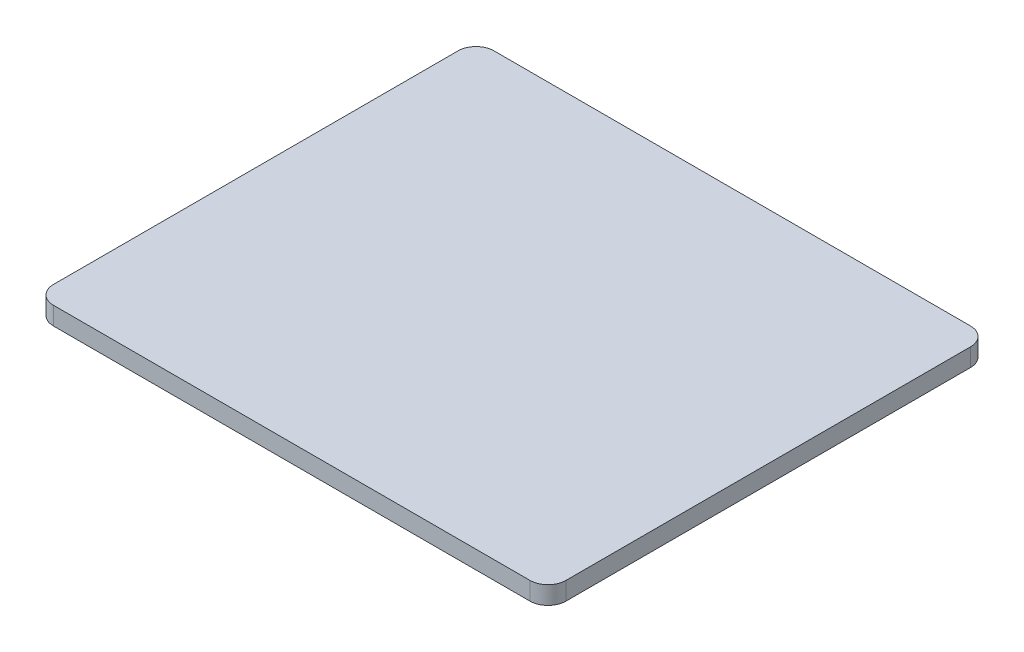
ISO-10303-21;
HEADER;
FILE_DESCRIPTION(('STEP AP214'),'2;1');
FILE_NAME('part.step','',(''),(''),'','','');
FILE_SCHEMA(('AUTOMOTIVE_DESIGN { 1 0 10303 214 1 1 1 1 }'));
ENDSEC;
DATA;
#1=APPLICATION_CONTEXT('core data for automotive mechanical design processes');
#2=APPLICATION_PROTOCOL_DEFINITION('international standard','automotive_design',2000,#1);
#3=PRODUCT_CONTEXT('',#1,'mechanical');
#4=PRODUCT('Part','Part','',(#3));
#5=PRODUCT_RELATED_PRODUCT_CATEGORY('part','',(#4));
#6=PRODUCT_DEFINITION_FORMATION('','',#4);
#7=PRODUCT_DEFINITION_CONTEXT('part definition',#1,'design');
#8=PRODUCT_DEFINITION('design','',#6,#7);
#9=PRODUCT_DEFINITION_SHAPE('','',#8);
#10=(LENGTH_UNIT() NAMED_UNIT(*) SI_UNIT(.MILLI.,.METRE.));
#11=(NAMED_UNIT(*) PLANE_ANGLE_UNIT() SI_UNIT($,.RADIAN.));
#12=(NAMED_UNIT(*) SI_UNIT($,.STERADIAN.) SOLID_ANGLE_UNIT());
#13=UNCERTAINTY_MEASURE_WITH_UNIT(LENGTH_MEASURE(1.E-05),#10,'distance_accuracy_value','');
#14=(GEOMETRIC_REPRESENTATION_CONTEXT(3) GLOBAL_UNCERTAINTY_ASSIGNED_CONTEXT((#13)) GLOBAL_UNIT_ASSIGNED_CONTEXT((#10,
#11,#12)) REPRESENTATION_CONTEXT('',''));
#15=CARTESIAN_POINT('',(0.,0.,0.));
#16=DIRECTION('',(0.,0.,1.));
#17=DIRECTION('',(1.,0.,0.));
#18=AXIS2_PLACEMENT_3D('',#15,#16,#17);
#19=CARTESIAN_POINT('',(-26.5,2.,22.5));
#20=DIRECTION('',(0.,-1.,0.));
#21=DIRECTION('',(0.,0.,-1.));
#22=AXIS2_PLACEMENT_3D('',#19,#20,#21);
#23=CYLINDRICAL_SURFACE('',#22,2.);
#24=CARTESIAN_POINT('',(-26.5,0.,22.5));
#25=DIRECTION('',(0.,1.,0.));
#26=DIRECTION('',(0.,0.,1.));
#27=AXIS2_PLACEMENT_3D('',#24,#25,#26);
#28=CIRCLE('',#27,2.);
#29=CARTESIAN_POINT('',(-28.5,0.,22.5));
#30=VERTEX_POINT('',#29);
#31=CARTESIAN_POINT('',(-26.5,0.,24.5));
#32=VERTEX_POINT('',#31);
#33=EDGE_CURVE('E129',#30,#32,#28,.T.);
#34=ORIENTED_EDGE('',*,*,#33,.T.);
#35=DIRECTION('',(0.,-1.,0.));
#36=VECTOR('',#35,1.);
#37=CARTESIAN_POINT('',(-26.5,2.,24.5));
#38=LINE('',#37,#36);
#39=CARTESIAN_POINT('',(-26.5,2.,24.5));
#40=VERTEX_POINT('',#39);
#41=EDGE_CURVE('E11',#40,#32,#38,.T.);
#42=ORIENTED_EDGE('',*,*,#41,.F.);
#43=CARTESIAN_POINT('',(-26.5,2.,22.5));
#44=DIRECTION('',(0.,1.,0.));
#45=DIRECTION('',(0.,0.,1.));
#46=AXIS2_PLACEMENT_3D('',#43,#44,#45);
#47=CIRCLE('',#46,2.);
#48=CARTESIAN_POINT('',(-28.5,2.,22.5));
#49=VERTEX_POINT('',#48);
#50=EDGE_CURVE('E143',#49,#40,#47,.T.);
#51=ORIENTED_EDGE('',*,*,#50,.F.);
#52=DIRECTION('',(0.,-1.,0.));
#53=VECTOR('',#52,1.);
#54=CARTESIAN_POINT('',(-28.5,2.,22.5));
#55=LINE('',#54,#53);
#56=EDGE_CURVE('E125',#49,#30,#55,.T.);
#57=ORIENTED_EDGE('',*,*,#56,.T.);
#58=EDGE_LOOP('',(#34,#42,#51,#57));
#59=FACE_BOUND('',#58,.T.);
#60=ADVANCED_FACE('F33',(#59),#23,.T.);
#61=CARTESIAN_POINT('',(-26.5,2.,24.5));
#62=DIRECTION('',(0.,0.,-1.));
#63=DIRECTION('',(-1.,0.,0.));
#64=AXIS2_PLACEMENT_3D('',#61,#62,#63);
#65=PLANE('',#64);
#66=DIRECTION('',(1.,0.,0.));
#67=VECTOR('',#66,1.);
#68=CARTESIAN_POINT('',(-26.5,0.,24.5));
#69=LINE('',#68,#67);
#70=CARTESIAN_POINT('',(26.5,0.,24.5));
#71=VERTEX_POINT('',#70);
#72=EDGE_CURVE('E132',#32,#71,#69,.T.);
#73=ORIENTED_EDGE('',*,*,#72,.T.);
#74=DIRECTION('',(0.,-1.,0.));
#75=VECTOR('',#74,1.);
#76=CARTESIAN_POINT('',(26.5,2.,24.5));
#77=LINE('',#76,#75);
#78=CARTESIAN_POINT('',(26.5,2.,24.5));
#79=VERTEX_POINT('',#78);
#80=EDGE_CURVE('E41',#79,#71,#77,.T.);
#81=ORIENTED_EDGE('',*,*,#80,.F.);
#82=DIRECTION('',(1.,0.,0.));
#83=VECTOR('',#82,1.);
#84=CARTESIAN_POINT('',(-26.5,2.,24.5));
#85=LINE('',#84,#83);
#86=EDGE_CURVE('E92',#40,#79,#85,.T.);
#87=ORIENTED_EDGE('',*,*,#86,.F.);
#88=ORIENTED_EDGE('',*,*,#41,.T.);
#89=EDGE_LOOP('',(#73,#81,#87,#88));
#90=FACE_BOUND('',#89,.T.);
#91=ADVANCED_FACE('F178',(#90),#65,.F.);
#92=CARTESIAN_POINT('',(26.5,2.,22.5));
#93=DIRECTION('',(0.,-1.,0.));
#94=DIRECTION('',(0.,0.,-1.));
#95=AXIS2_PLACEMENT_3D('',#92,#93,#94);
#96=CYLINDRICAL_SURFACE('',#95,2.);
#97=CARTESIAN_POINT('',(26.5,0.,22.5));
#98=DIRECTION('',(0.,1.,0.));
#99=DIRECTION('',(0.,0.,1.));
#100=AXIS2_PLACEMENT_3D('',#97,#98,#99);
#101=CIRCLE('',#100,2.);
#102=CARTESIAN_POINT('',(28.5,0.,22.5));
#103=VERTEX_POINT('',#102);
#104=EDGE_CURVE('E134',#71,#103,#101,.T.);
#105=ORIENTED_EDGE('',*,*,#104,.T.);
#106=DIRECTION('',(0.,-1.,0.));
#107=VECTOR('',#106,1.);
#108=CARTESIAN_POINT('',(28.5,2.,22.5));
#109=LINE('',#108,#107);
#110=CARTESIAN_POINT('',(28.5,2.,22.5));
#111=VERTEX_POINT('',#110);
#112=EDGE_CURVE('E150',#111,#103,#109,.T.);
#113=ORIENTED_EDGE('',*,*,#112,.F.);
#114=CARTESIAN_POINT('',(26.5,2.,22.5));
#115=DIRECTION('',(0.,1.,0.));
#116=DIRECTION('',(0.,0.,1.));
#117=AXIS2_PLACEMENT_3D('',#114,#115,#116);
#118=CIRCLE('',#117,2.);
#119=EDGE_CURVE('E158',#79,#111,#118,.T.);
#120=ORIENTED_EDGE('',*,*,#119,.F.);
#121=ORIENTED_EDGE('',*,*,#80,.T.);
#122=EDGE_LOOP('',(#105,#113,#120,#121));
#123=FACE_BOUND('',#122,.T.);
#124=ADVANCED_FACE('F156',(#123),#96,.T.);
#125=CARTESIAN_POINT('',(28.5,2.,22.5));
#126=DIRECTION('',(-1.,0.,0.));
#127=DIRECTION('',(0.,0.,1.));
#128=AXIS2_PLACEMENT_3D('',#125,#126,#127);
#129=PLANE('',#128);
#130=DIRECTION('',(0.,0.,-1.));
#131=VECTOR('',#130,1.);
#132=CARTESIAN_POINT('',(28.5,0.,22.5));
#133=LINE('',#132,#131);
#134=CARTESIAN_POINT('',(28.5,0.,-22.5));
#135=VERTEX_POINT('',#134);
#136=EDGE_CURVE('E136',#103,#135,#133,.T.);
#137=ORIENTED_EDGE('',*,*,#136,.T.);
#138=DIRECTION('',(0.,-1.,0.));
#139=VECTOR('',#138,1.);
#140=CARTESIAN_POINT('',(28.5,2.,-22.5));
#141=LINE('',#140,#139);
#142=CARTESIAN_POINT('',(28.5,2.,-22.5));
#143=VERTEX_POINT('',#142);
#144=EDGE_CURVE('E147',#143,#135,#141,.T.);
#145=ORIENTED_EDGE('',*,*,#144,.F.);
#146=DIRECTION('',(0.,0.,-1.));
#147=VECTOR('',#146,1.);
#148=CARTESIAN_POINT('',(28.5,2.,22.5));
#149=LINE('',#148,#147);
#150=EDGE_CURVE('E170',#111,#143,#149,.T.);
#151=ORIENTED_EDGE('',*,*,#150,.F.);
#152=ORIENTED_EDGE('',*,*,#112,.T.);
#153=EDGE_LOOP('',(#137,#145,#151,#152));
#154=FACE_BOUND('',#153,.T.);
#155=ADVANCED_FACE('F166',(#154),#129,.F.);
#156=CARTESIAN_POINT('',(26.5,2.,-22.5));
#157=DIRECTION('',(0.,-1.,0.));
#158=DIRECTION('',(0.,0.,-1.));
#159=AXIS2_PLACEMENT_3D('',#156,#157,#158);
#160=CYLINDRICAL_SURFACE('',#159,2.);
#161=CARTESIAN_POINT('',(26.5,0.,-22.5));
#162=DIRECTION('',(0.,1.,0.));
#163=DIRECTION('',(0.,0.,1.));
#164=AXIS2_PLACEMENT_3D('',#161,#162,#163);
#165=CIRCLE('',#164,2.);
#166=CARTESIAN_POINT('',(26.5,0.,-24.5));
#167=VERTEX_POINT('',#166);
#168=EDGE_CURVE('E138',#135,#167,#165,.T.);
#169=ORIENTED_EDGE('',*,*,#168,.T.);
#170=DIRECTION('',(0.,-1.,0.));
#171=VECTOR('',#170,1.);
#172=CARTESIAN_POINT('',(26.5,2.,-24.5));
#173=LINE('',#172,#171);
#174=CARTESIAN_POINT('',(26.5,2.,-24.5));
#175=VERTEX_POINT('',#174);
#176=EDGE_CURVE('E120',#175,#167,#173,.T.);
#177=ORIENTED_EDGE('',*,*,#176,.F.);
#178=CARTESIAN_POINT('',(26.5,2.,-22.5));
#179=DIRECTION('',(0.,1.,0.));
#180=DIRECTION('',(0.,0.,1.));
#181=AXIS2_PLACEMENT_3D('',#178,#179,#180);
#182=CIRCLE('',#181,2.);
#183=EDGE_CURVE('E111',#143,#175,#182,.T.);
#184=ORIENTED_EDGE('',*,*,#183,.F.);
#185=ORIENTED_EDGE('',*,*,#144,.T.);
#186=EDGE_LOOP('',(#169,#177,#184,#185));
#187=FACE_BOUND('',#186,.T.);
#188=ADVANCED_FACE('F169',(#187),#160,.T.);
#189=CARTESIAN_POINT('',(-26.5,2.,-24.5));
#190=DIRECTION('',(0.,0.,1.));
#191=DIRECTION('',(1.,0.,0.));
#192=AXIS2_PLACEMENT_3D('',#189,#190,#191);
#193=PLANE('',#192);
#194=DIRECTION('',(-1.,0.,0.));
#195=VECTOR('',#194,1.);
#196=CARTESIAN_POINT('',(-26.5,0.,-24.5));
#197=LINE('',#196,#195);
#198=CARTESIAN_POINT('',(-26.5,0.,-24.5));
#199=VERTEX_POINT('',#198);
#200=EDGE_CURVE('E119',#167,#199,#197,.T.);
#201=ORIENTED_EDGE('',*,*,#200,.T.);
#202=DIRECTION('',(0.,-1.,0.));
#203=VECTOR('',#202,1.);
#204=CARTESIAN_POINT('',(-26.5,2.,-24.5));
#205=LINE('',#204,#203);
#206=CARTESIAN_POINT('',(-26.5,2.,-24.5));
#207=VERTEX_POINT('',#206);
#208=EDGE_CURVE('E116',#207,#199,#205,.T.);
#209=ORIENTED_EDGE('',*,*,#208,.F.);
#210=DIRECTION('',(-1.,0.,0.));
#211=VECTOR('',#210,1.);
#212=CARTESIAN_POINT('',(-26.5,2.,-24.5));
#213=LINE('',#212,#211);
#214=EDGE_CURVE('E105',#175,#207,#213,.T.);
#215=ORIENTED_EDGE('',*,*,#214,.F.);
#216=ORIENTED_EDGE('',*,*,#176,.T.);
#217=EDGE_LOOP('',(#201,#209,#215,#216));
#218=FACE_BOUND('',#217,.T.);
#219=ADVANCED_FACE('F117',(#218),#193,.F.);
#220=CARTESIAN_POINT('',(-26.5,2.,-22.5));
#221=DIRECTION('',(0.,-1.,0.));
#222=DIRECTION('',(0.,0.,-1.));
#223=AXIS2_PLACEMENT_3D('',#220,#221,#222);
#224=CYLINDRICAL_SURFACE('',#223,2.);
#225=CARTESIAN_POINT('',(-26.5,0.,-22.5));
#226=DIRECTION('',(0.,1.,0.));
#227=DIRECTION('',(0.,0.,1.));
#228=AXIS2_PLACEMENT_3D('',#225,#226,#227);
#229=CIRCLE('',#228,2.);
#230=CARTESIAN_POINT('',(-28.5,0.,-22.5));
#231=VERTEX_POINT('',#230);
#232=EDGE_CURVE('E78',#199,#231,#229,.T.);
#233=ORIENTED_EDGE('',*,*,#232,.T.);
#234=DIRECTION('',(0.,-1.,0.));
#235=VECTOR('',#234,1.);
#236=CARTESIAN_POINT('',(-28.5,2.,-22.5));
#237=LINE('',#236,#235);
#238=CARTESIAN_POINT('',(-28.5,2.,-22.5));
#239=VERTEX_POINT('',#238);
#240=EDGE_CURVE('E121',#239,#231,#237,.T.);
#241=ORIENTED_EDGE('',*,*,#240,.F.);
#242=CARTESIAN_POINT('',(-26.5,2.,-22.5));
#243=DIRECTION('',(0.,1.,0.));
#244=DIRECTION('',(0.,0.,1.));
#245=AXIS2_PLACEMENT_3D('',#242,#243,#244);
#246=CIRCLE('',#245,2.);
#247=EDGE_CURVE('E109',#207,#239,#246,.T.);
#248=ORIENTED_EDGE('',*,*,#247,.F.);
#249=ORIENTED_EDGE('',*,*,#208,.T.);
#250=EDGE_LOOP('',(#233,#241,#248,#249));
#251=FACE_BOUND('',#250,.T.);
#252=ADVANCED_FACE('F123',(#251),#224,.T.);
#253=CARTESIAN_POINT('',(-28.5,2.,22.5));
#254=DIRECTION('',(1.,0.,0.));
#255=DIRECTION('',(0.,0.,-1.));
#256=AXIS2_PLACEMENT_3D('',#253,#254,#255);
#257=PLANE('',#256);
#258=DIRECTION('',(0.,0.,1.));
#259=VECTOR('',#258,1.);
#260=CARTESIAN_POINT('',(-28.5,0.,22.5));
#261=LINE('',#260,#259);
#262=EDGE_CURVE('E84',#231,#30,#261,.T.);
#263=ORIENTED_EDGE('',*,*,#262,.T.);
#264=ORIENTED_EDGE('',*,*,#56,.F.);
#265=DIRECTION('',(0.,0.,1.));
#266=VECTOR('',#265,1.);
#267=CARTESIAN_POINT('',(-28.5,2.,22.5));
#268=LINE('',#267,#266);
#269=EDGE_CURVE('E49',#239,#49,#268,.T.);
#270=ORIENTED_EDGE('',*,*,#269,.F.);
#271=ORIENTED_EDGE('',*,*,#240,.T.);
#272=EDGE_LOOP('',(#263,#264,#270,#271));
#273=FACE_BOUND('',#272,.T.);
#274=ADVANCED_FACE('F194',(#273),#257,.F.);
#275=CARTESIAN_POINT('',(-26.5,2.,22.5));
#276=DIRECTION('',(0.,1.,0.));
#277=DIRECTION('',(0.,0.,1.));
#278=AXIS2_PLACEMENT_3D('',#275,#276,#277);
#279=PLANE('',#278);
#280=ORIENTED_EDGE('',*,*,#50,.T.);
#281=ORIENTED_EDGE('',*,*,#86,.T.);
#282=ORIENTED_EDGE('',*,*,#119,.T.);
#283=ORIENTED_EDGE('',*,*,#150,.T.);
#284=ORIENTED_EDGE('',*,*,#183,.T.);
#285=ORIENTED_EDGE('',*,*,#214,.T.);
#286=ORIENTED_EDGE('',*,*,#247,.T.);
#287=ORIENTED_EDGE('',*,*,#269,.T.);
#288=EDGE_LOOP('',(#280,#281,#282,#283,#284,#285,#286,#287));
#289=FACE_BOUND('',#288,.T.);
#290=ADVANCED_FACE('F107',(#289),#279,.T.);
#291=CARTESIAN_POINT('',(-26.5,0.,22.5));
#292=DIRECTION('',(0.,1.,0.));
#293=DIRECTION('',(0.,0.,1.));
#294=AXIS2_PLACEMENT_3D('',#291,#292,#293);
#295=PLANE('',#294);
#296=ORIENTED_EDGE('',*,*,#33,.F.);
#297=ORIENTED_EDGE('',*,*,#262,.F.);
#298=ORIENTED_EDGE('',*,*,#232,.F.);
#299=ORIENTED_EDGE('',*,*,#200,.F.);
#300=ORIENTED_EDGE('',*,*,#168,.F.);
#301=ORIENTED_EDGE('',*,*,#136,.F.);
#302=ORIENTED_EDGE('',*,*,#104,.F.);
#303=ORIENTED_EDGE('',*,*,#72,.F.);
#304=EDGE_LOOP('',(#296,#297,#298,#299,#300,#301,#302,#303));
#305=FACE_BOUND('',#304,.T.);
#306=ADVANCED_FACE('F162',(#305),#295,.F.);
#307=CLOSED_SHELL('',(#60,#91,#124,#155,#188,#219,#252,#274,#290,#306));
#308=MANIFOLD_SOLID_BREP('B2',#307);
#309=ADVANCED_BREP_SHAPE_REPRESENTATION('',(#18,#308),#14);
#310=SHAPE_DEFINITION_REPRESENTATION(#9,#309);
ENDSEC;
END-ISO-10303-21;
